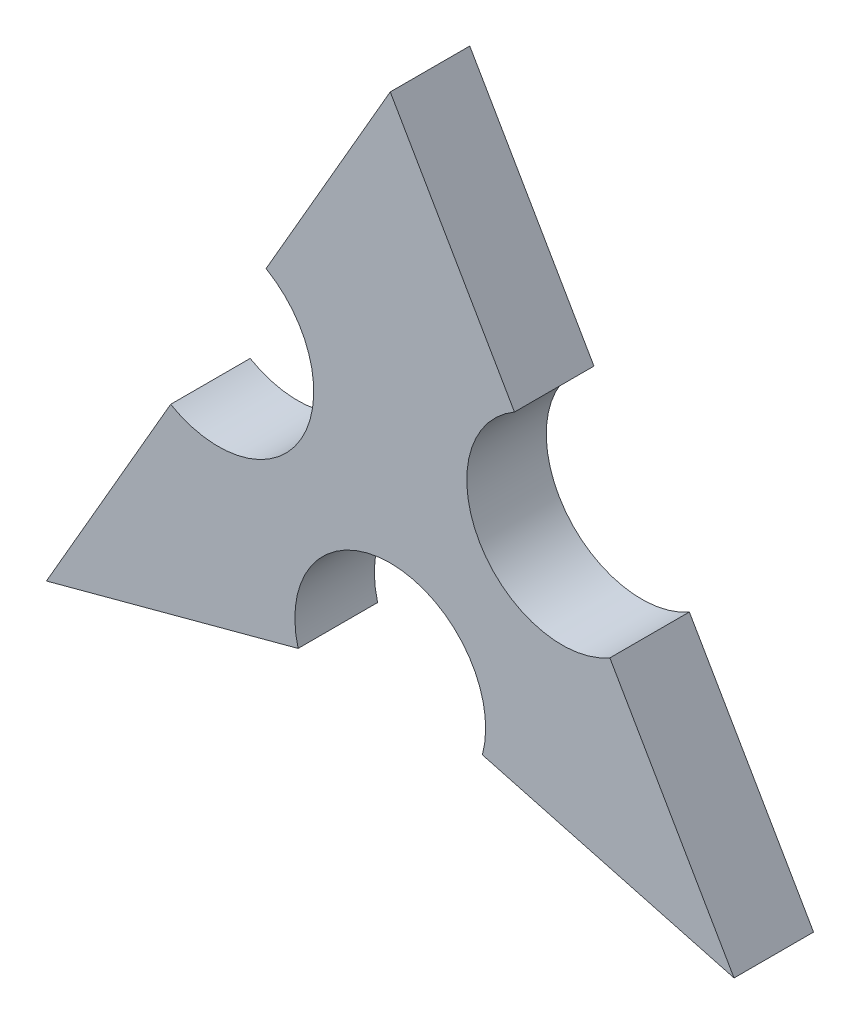
ISO-10303-21;
HEADER;
FILE_DESCRIPTION(('STEP AP214'),'2;1');
FILE_NAME('part.step','',(''),(''),'','','');
FILE_SCHEMA(('AUTOMOTIVE_DESIGN { 1 0 10303 214 1 1 1 1 }'));
ENDSEC;
DATA;
#1=APPLICATION_CONTEXT('core data for automotive mechanical design processes');
#2=APPLICATION_PROTOCOL_DEFINITION('international standard','automotive_design',2000,#1);
#3=PRODUCT_CONTEXT('',#1,'mechanical');
#4=PRODUCT('Part','Part','',(#3));
#5=PRODUCT_RELATED_PRODUCT_CATEGORY('part','',(#4));
#6=PRODUCT_DEFINITION_FORMATION('','',#4);
#7=PRODUCT_DEFINITION_CONTEXT('part definition',#1,'design');
#8=PRODUCT_DEFINITION('design','',#6,#7);
#9=PRODUCT_DEFINITION_SHAPE('','',#8);
#10=(LENGTH_UNIT() NAMED_UNIT(*) SI_UNIT(.MILLI.,.METRE.));
#11=(NAMED_UNIT(*) PLANE_ANGLE_UNIT() SI_UNIT($,.RADIAN.));
#12=(NAMED_UNIT(*) SI_UNIT($,.STERADIAN.) SOLID_ANGLE_UNIT());
#13=UNCERTAINTY_MEASURE_WITH_UNIT(LENGTH_MEASURE(1.E-05),#10,'distance_accuracy_value','');
#14=(GEOMETRIC_REPRESENTATION_CONTEXT(3) GLOBAL_UNCERTAINTY_ASSIGNED_CONTEXT((#13)) GLOBAL_UNIT_ASSIGNED_CONTEXT((#10,
#11,#12)) REPRESENTATION_CONTEXT('',''));
#15=CARTESIAN_POINT('',(0.,0.,0.));
#16=DIRECTION('',(0.,0.,1.));
#17=DIRECTION('',(1.,0.,0.));
#18=AXIS2_PLACEMENT_3D('',#15,#16,#17);
#19=CARTESIAN_POINT('',(-31.25,95.6958071181805,10.));
#20=DIRECTION('',(0.866025403784439,-0.5,0.));
#21=DIRECTION('',(0.5,0.866025403784439,0.));
#22=AXIS2_PLACEMENT_3D('',#19,#20,#21);
#23=PLANE('',#22);
#24=DIRECTION('',(-0.5,-0.866025403784439,0.));
#25=VECTOR('',#24,1.);
#26=CARTESIAN_POINT('',(-31.25,95.6958071181805,-10.));
#27=LINE('',#26,#25);
#28=CARTESIAN_POINT('',(0.,149.822394854708,-10.));
#29=VERTEX_POINT('',#28);
#30=CARTESIAN_POINT('',(-31.25,95.6958071181805,-10.));
#31=VERTEX_POINT('',#30);
#32=EDGE_CURVE('E139',#29,#31,#27,.T.);
#33=ORIENTED_EDGE('',*,*,#32,.T.);
#34=DIRECTION('',(0.,0.,-1.));
#35=VECTOR('',#34,1.);
#36=CARTESIAN_POINT('',(-31.25,95.6958071181805,10.));
#37=LINE('',#36,#35);
#38=CARTESIAN_POINT('',(-31.25,95.6958071181805,10.));
#39=VERTEX_POINT('',#38);
#40=EDGE_CURVE('E11',#39,#31,#37,.T.);
#41=ORIENTED_EDGE('',*,*,#40,.F.);
#42=DIRECTION('',(-0.5,-0.866025403784439,0.));
#43=VECTOR('',#42,1.);
#44=CARTESIAN_POINT('',(-31.25,95.6958071181805,10.));
#45=LINE('',#44,#43);
#46=CARTESIAN_POINT('',(0.,149.822394854708,10.));
#47=VERTEX_POINT('',#46);
#48=EDGE_CURVE('E155',#47,#39,#45,.T.);
#49=ORIENTED_EDGE('',*,*,#48,.F.);
#50=DIRECTION('',(0.,0.,-1.));
#51=VECTOR('',#50,1.);
#52=CARTESIAN_POINT('',(0.,149.822394854708,10.));
#53=LINE('',#52,#51);
#54=EDGE_CURVE('E135',#47,#29,#53,.T.);
#55=ORIENTED_EDGE('',*,*,#54,.T.);
#56=EDGE_LOOP('',(#33,#41,#49,#55));
#57=FACE_BOUND('',#56,.T.);
#58=ADVANCED_FACE('F37',(#57),#23,.F.);
#59=CARTESIAN_POINT('',(-43.25,74.9111974273539,10.));
#60=DIRECTION('',(0.,0.,-1.));
#61=DIRECTION('',(-1.,0.,0.));
#62=AXIS2_PLACEMENT_3D('',#59,#60,#61);
#63=CYLINDRICAL_SURFACE('',#62,24.);
#64=CARTESIAN_POINT('',(-43.25,74.9111974273539,-10.));
#65=DIRECTION('',(0.,0.,-1.));
#66=DIRECTION('',(1.,0.,0.));
#67=AXIS2_PLACEMENT_3D('',#64,#65,#66);
#68=CIRCLE('',#67,24.);
#69=CARTESIAN_POINT('',(-55.25,54.1265877365274,-10.));
#70=VERTEX_POINT('',#69);
#71=EDGE_CURVE('E142',#31,#70,#68,.T.);
#72=ORIENTED_EDGE('',*,*,#71,.T.);
#73=DIRECTION('',(0.,0.,-1.));
#74=VECTOR('',#73,1.);
#75=CARTESIAN_POINT('',(-55.25,54.1265877365274,10.));
#76=LINE('',#75,#74);
#77=CARTESIAN_POINT('',(-55.25,54.1265877365274,10.));
#78=VERTEX_POINT('',#77);
#79=EDGE_CURVE('E45',#78,#70,#76,.T.);
#80=ORIENTED_EDGE('',*,*,#79,.F.);
#81=CARTESIAN_POINT('',(-43.25,74.9111974273539,10.));
#82=DIRECTION('',(0.,0.,-1.));
#83=DIRECTION('',(1.,0.,0.));
#84=AXIS2_PLACEMENT_3D('',#81,#82,#83);
#85=CIRCLE('',#84,24.);
#86=EDGE_CURVE('E99',#39,#78,#85,.T.);
#87=ORIENTED_EDGE('',*,*,#86,.F.);
#88=ORIENTED_EDGE('',*,*,#40,.T.);
#89=EDGE_LOOP('',(#72,#80,#87,#88));
#90=FACE_BOUND('',#89,.T.);
#91=ADVANCED_FACE('F198',(#90),#63,.F.);
#92=CARTESIAN_POINT('',(-86.5,0.,10.));
#93=DIRECTION('',(0.866025403784439,-0.5,0.));
#94=DIRECTION('',(0.5,0.866025403784439,0.));
#95=AXIS2_PLACEMENT_3D('',#92,#93,#94);
#96=PLANE('',#95);
#97=DIRECTION('',(-0.5,-0.866025403784439,0.));
#98=VECTOR('',#97,1.);
#99=CARTESIAN_POINT('',(-86.5,0.,-10.));
#100=LINE('',#99,#98);
#101=CARTESIAN_POINT('',(-86.5,0.,-10.));
#102=VERTEX_POINT('',#101);
#103=EDGE_CURVE('E144',#70,#102,#100,.T.);
#104=ORIENTED_EDGE('',*,*,#103,.T.);
#105=DIRECTION('',(0.,0.,-1.));
#106=VECTOR('',#105,1.);
#107=CARTESIAN_POINT('',(-86.5,0.,10.));
#108=LINE('',#107,#106);
#109=CARTESIAN_POINT('',(-86.5,0.,10.));
#110=VERTEX_POINT('',#109);
#111=EDGE_CURVE('E165',#110,#102,#108,.T.);
#112=ORIENTED_EDGE('',*,*,#111,.F.);
#113=DIRECTION('',(-0.5,-0.866025403784439,0.));
#114=VECTOR('',#113,1.);
#115=CARTESIAN_POINT('',(-86.5,0.,10.));
#116=LINE('',#115,#114);
#117=EDGE_CURVE('E173',#78,#110,#116,.T.);
#118=ORIENTED_EDGE('',*,*,#117,.F.);
#119=ORIENTED_EDGE('',*,*,#79,.T.);
#120=EDGE_LOOP('',(#104,#112,#118,#119));
#121=FACE_BOUND('',#120,.T.);
#122=ADVANCED_FACE('F171',(#121),#96,.F.);
#123=CARTESIAN_POINT('',(-23.1822198309376,16.965948062832,10.));
#124=DIRECTION('',(-0.258819045102526,0.965925826289067,0.));
#125=DIRECTION('',(-0.965925826289067,-0.258819045102526,0.));
#126=AXIS2_PLACEMENT_3D('',#123,#124,#125);
#127=PLANE('',#126);
#128=DIRECTION('',(0.965925826289067,0.258819045102526,0.));
#129=VECTOR('',#128,1.);
#130=CARTESIAN_POINT('',(-23.1822198309376,16.965948062832,-10.));
#131=LINE('',#130,#129);
#132=CARTESIAN_POINT('',(-23.1822198309376,16.965948062832,-10.));
#133=VERTEX_POINT('',#132);
#134=EDGE_CURVE('E146',#102,#133,#131,.T.);
#135=ORIENTED_EDGE('',*,*,#134,.T.);
#136=DIRECTION('',(0.,0.,-1.));
#137=VECTOR('',#136,1.);
#138=CARTESIAN_POINT('',(-23.1822198309376,16.965948062832,10.));
#139=LINE('',#138,#137);
#140=CARTESIAN_POINT('',(-23.1822198309376,16.965948062832,10.));
#141=VERTEX_POINT('',#140);
#142=EDGE_CURVE('E162',#141,#133,#139,.T.);
#143=ORIENTED_EDGE('',*,*,#142,.F.);
#144=DIRECTION('',(0.965925826289067,0.258819045102526,0.));
#145=VECTOR('',#144,1.);
#146=CARTESIAN_POINT('',(-23.1822198309376,16.965948062832,10.));
#147=LINE('',#146,#145);
#148=EDGE_CURVE('E189',#110,#141,#147,.T.);
#149=ORIENTED_EDGE('',*,*,#148,.F.);
#150=ORIENTED_EDGE('',*,*,#111,.T.);
#151=EDGE_LOOP('',(#135,#143,#149,#150));
#152=FACE_BOUND('',#151,.T.);
#153=ADVANCED_FACE('F182',(#152),#127,.F.);
#154=CARTESIAN_POINT('',(0.,23.1776051452926,10.));
#155=DIRECTION('',(0.,0.,-1.));
#156=DIRECTION('',(-1.,0.,0.));
#157=AXIS2_PLACEMENT_3D('',#154,#155,#156);
#158=CYLINDRICAL_SURFACE('',#157,24.);
#159=CARTESIAN_POINT('',(0.,23.1776051452926,-10.));
#160=DIRECTION('',(0.,0.,-1.));
#161=DIRECTION('',(1.,0.,0.));
#162=AXIS2_PLACEMENT_3D('',#159,#160,#161);
#163=CIRCLE('',#162,24.);
#164=CARTESIAN_POINT('',(23.1822198309376,16.965948062832,-10.));
#165=VERTEX_POINT('',#164);
#166=EDGE_CURVE('E148',#133,#165,#163,.T.);
#167=ORIENTED_EDGE('',*,*,#166,.T.);
#168=DIRECTION('',(0.,0.,-1.));
#169=VECTOR('',#168,1.);
#170=CARTESIAN_POINT('',(23.1822198309376,16.965948062832,10.));
#171=LINE('',#170,#169);
#172=CARTESIAN_POINT('',(23.1822198309376,16.965948062832,10.));
#173=VERTEX_POINT('',#172);
#174=EDGE_CURVE('E159',#173,#165,#171,.T.);
#175=ORIENTED_EDGE('',*,*,#174,.F.);
#176=CARTESIAN_POINT('',(0.,23.1776051452926,10.));
#177=DIRECTION('',(0.,0.,-1.));
#178=DIRECTION('',(1.,0.,0.));
#179=AXIS2_PLACEMENT_3D('',#176,#177,#178);
#180=CIRCLE('',#179,24.);
#181=EDGE_CURVE('E188',#141,#173,#180,.T.);
#182=ORIENTED_EDGE('',*,*,#181,.F.);
#183=ORIENTED_EDGE('',*,*,#142,.T.);
#184=EDGE_LOOP('',(#167,#175,#182,#183));
#185=FACE_BOUND('',#184,.T.);
#186=ADVANCED_FACE('F186',(#185),#158,.F.);
#187=CARTESIAN_POINT('',(86.5,0.,10.));
#188=DIRECTION('',(0.258819045102526,0.965925826289067,0.));
#189=DIRECTION('',(-0.965925826289067,0.258819045102526,0.));
#190=AXIS2_PLACEMENT_3D('',#187,#188,#189);
#191=PLANE('',#190);
#192=DIRECTION('',(0.965925826289067,-0.258819045102526,0.));
#193=VECTOR('',#192,1.);
#194=CARTESIAN_POINT('',(86.5,0.,-10.));
#195=LINE('',#194,#193);
#196=CARTESIAN_POINT('',(86.5,0.,-10.));
#197=VERTEX_POINT('',#196);
#198=EDGE_CURVE('E150',#165,#197,#195,.T.);
#199=ORIENTED_EDGE('',*,*,#198,.T.);
#200=DIRECTION('',(0.,0.,-1.));
#201=VECTOR('',#200,1.);
#202=CARTESIAN_POINT('',(86.5,0.,10.));
#203=LINE('',#202,#201);
#204=CARTESIAN_POINT('',(86.5,0.,10.));
#205=VERTEX_POINT('',#204);
#206=EDGE_CURVE('E130',#205,#197,#203,.T.);
#207=ORIENTED_EDGE('',*,*,#206,.F.);
#208=DIRECTION('',(0.965925826289067,-0.258819045102526,0.));
#209=VECTOR('',#208,1.);
#210=CARTESIAN_POINT('',(86.5,0.,10.));
#211=LINE('',#210,#209);
#212=EDGE_CURVE('E121',#173,#205,#211,.T.);
#213=ORIENTED_EDGE('',*,*,#212,.F.);
#214=ORIENTED_EDGE('',*,*,#174,.T.);
#215=EDGE_LOOP('',(#199,#207,#213,#214));
#216=FACE_BOUND('',#215,.T.);
#217=ADVANCED_FACE('F210',(#216),#191,.F.);
#218=CARTESIAN_POINT('',(55.25,54.1265877365274,10.));
#219=DIRECTION('',(-0.866025403784439,-0.5,0.));
#220=DIRECTION('',(0.5,-0.866025403784439,0.));
#221=AXIS2_PLACEMENT_3D('',#218,#219,#220);
#222=PLANE('',#221);
#223=DIRECTION('',(-0.5,0.866025403784439,0.));
#224=VECTOR('',#223,1.);
#225=CARTESIAN_POINT('',(55.25,54.1265877365274,-10.));
#226=LINE('',#225,#224);
#227=CARTESIAN_POINT('',(55.25,54.1265877365274,-10.));
#228=VERTEX_POINT('',#227);
#229=EDGE_CURVE('E129',#197,#228,#226,.T.);
#230=ORIENTED_EDGE('',*,*,#229,.T.);
#231=DIRECTION('',(0.,0.,-1.));
#232=VECTOR('',#231,1.);
#233=CARTESIAN_POINT('',(55.25,54.1265877365274,10.));
#234=LINE('',#233,#232);
#235=CARTESIAN_POINT('',(55.25,54.1265877365274,10.));
#236=VERTEX_POINT('',#235);
#237=EDGE_CURVE('E126',#236,#228,#234,.T.);
#238=ORIENTED_EDGE('',*,*,#237,.F.);
#239=DIRECTION('',(-0.5,0.866025403784439,0.));
#240=VECTOR('',#239,1.);
#241=CARTESIAN_POINT('',(55.25,54.1265877365274,10.));
#242=LINE('',#241,#240);
#243=EDGE_CURVE('E115',#205,#236,#242,.T.);
#244=ORIENTED_EDGE('',*,*,#243,.F.);
#245=ORIENTED_EDGE('',*,*,#206,.T.);
#246=EDGE_LOOP('',(#230,#238,#244,#245));
#247=FACE_BOUND('',#246,.T.);
#248=ADVANCED_FACE('F127',(#247),#222,.F.);
#249=CARTESIAN_POINT('',(43.25,74.9111974273539,10.));
#250=DIRECTION('',(0.,0.,-1.));
#251=DIRECTION('',(-1.,0.,0.));
#252=AXIS2_PLACEMENT_3D('',#249,#250,#251);
#253=CYLINDRICAL_SURFACE('',#252,24.);
#254=CARTESIAN_POINT('',(43.25,74.9111974273539,-10.));
#255=DIRECTION('',(0.,0.,-1.));
#256=DIRECTION('',(1.,0.,0.));
#257=AXIS2_PLACEMENT_3D('',#254,#255,#256);
#258=CIRCLE('',#257,24.);
#259=CARTESIAN_POINT('',(31.25,95.6958071181805,-10.));
#260=VERTEX_POINT('',#259);
#261=EDGE_CURVE('E85',#228,#260,#258,.T.);
#262=ORIENTED_EDGE('',*,*,#261,.T.);
#263=DIRECTION('',(0.,0.,-1.));
#264=VECTOR('',#263,1.);
#265=CARTESIAN_POINT('',(31.25,95.6958071181805,10.));
#266=LINE('',#265,#264);
#267=CARTESIAN_POINT('',(31.25,95.6958071181805,10.));
#268=VERTEX_POINT('',#267);
#269=EDGE_CURVE('E131',#268,#260,#266,.T.);
#270=ORIENTED_EDGE('',*,*,#269,.F.);
#271=CARTESIAN_POINT('',(43.25,74.9111974273539,10.));
#272=DIRECTION('',(0.,0.,-1.));
#273=DIRECTION('',(1.,0.,0.));
#274=AXIS2_PLACEMENT_3D('',#271,#272,#273);
#275=CIRCLE('',#274,24.);
#276=EDGE_CURVE('E119',#236,#268,#275,.T.);
#277=ORIENTED_EDGE('',*,*,#276,.F.);
#278=ORIENTED_EDGE('',*,*,#237,.T.);
#279=EDGE_LOOP('',(#262,#270,#277,#278));
#280=FACE_BOUND('',#279,.T.);
#281=ADVANCED_FACE('F133',(#280),#253,.F.);
#282=CARTESIAN_POINT('',(0.,149.822394854708,10.));
#283=DIRECTION('',(-0.866025403784439,-0.5,0.));
#284=DIRECTION('',(0.5,-0.866025403784439,0.));
#285=AXIS2_PLACEMENT_3D('',#282,#283,#284);
#286=PLANE('',#285);
#287=DIRECTION('',(-0.5,0.866025403784439,0.));
#288=VECTOR('',#287,1.);
#289=CARTESIAN_POINT('',(0.,149.822394854708,-10.));
#290=LINE('',#289,#288);
#291=EDGE_CURVE('E91',#260,#29,#290,.T.);
#292=ORIENTED_EDGE('',*,*,#291,.T.);
#293=ORIENTED_EDGE('',*,*,#54,.F.);
#294=DIRECTION('',(-0.5,0.866025403784439,0.));
#295=VECTOR('',#294,1.);
#296=CARTESIAN_POINT('',(0.,149.822394854708,10.));
#297=LINE('',#296,#295);
#298=EDGE_CURVE('E53',#268,#47,#297,.T.);
#299=ORIENTED_EDGE('',*,*,#298,.F.);
#300=ORIENTED_EDGE('',*,*,#269,.T.);
#301=EDGE_LOOP('',(#292,#293,#299,#300));
#302=FACE_BOUND('',#301,.T.);
#303=ADVANCED_FACE('F218',(#302),#286,.F.);
#304=CARTESIAN_POINT('',(43.25,74.9111974273539,10.));
#305=DIRECTION('',(0.,0.,1.));
#306=DIRECTION('',(1.,0.,0.));
#307=AXIS2_PLACEMENT_3D('',#304,#305,#306);
#308=PLANE('',#307);
#309=ORIENTED_EDGE('',*,*,#48,.T.);
#310=ORIENTED_EDGE('',*,*,#86,.T.);
#311=ORIENTED_EDGE('',*,*,#117,.T.);
#312=ORIENTED_EDGE('',*,*,#148,.T.);
#313=ORIENTED_EDGE('',*,*,#181,.T.);
#314=ORIENTED_EDGE('',*,*,#212,.T.);
#315=ORIENTED_EDGE('',*,*,#243,.T.);
#316=ORIENTED_EDGE('',*,*,#276,.T.);
#317=ORIENTED_EDGE('',*,*,#298,.T.);
#318=EDGE_LOOP('',(#309,#310,#311,#312,#313,#314,#315,#316,#317));
#319=FACE_BOUND('',#318,.T.);
#320=ADVANCED_FACE('F117',(#319),#308,.T.);
#321=CARTESIAN_POINT('',(43.25,74.9111974273539,-10.));
#322=DIRECTION('',(0.,0.,1.));
#323=DIRECTION('',(1.,0.,0.));
#324=AXIS2_PLACEMENT_3D('',#321,#322,#323);
#325=PLANE('',#324);
#326=ORIENTED_EDGE('',*,*,#32,.F.);
#327=ORIENTED_EDGE('',*,*,#291,.F.);
#328=ORIENTED_EDGE('',*,*,#261,.F.);
#329=ORIENTED_EDGE('',*,*,#229,.F.);
#330=ORIENTED_EDGE('',*,*,#198,.F.);
#331=ORIENTED_EDGE('',*,*,#166,.F.);
#332=ORIENTED_EDGE('',*,*,#134,.F.);
#333=ORIENTED_EDGE('',*,*,#103,.F.);
#334=ORIENTED_EDGE('',*,*,#71,.F.);
#335=EDGE_LOOP('',(#326,#327,#328,#329,#330,#331,#332,#333,#334));
#336=FACE_BOUND('',#335,.T.);
#337=ADVANCED_FACE('F177',(#336),#325,.F.);
#338=CLOSED_SHELL('',(#58,#91,#122,#153,#186,#217,#248,#281,#303,#320,#337));
#339=MANIFOLD_SOLID_BREP('B2',#338);
#340=ADVANCED_BREP_SHAPE_REPRESENTATION('',(#18,#339),#14);
#341=SHAPE_DEFINITION_REPRESENTATION(#9,#340);
ENDSEC;
END-ISO-10303-21;
